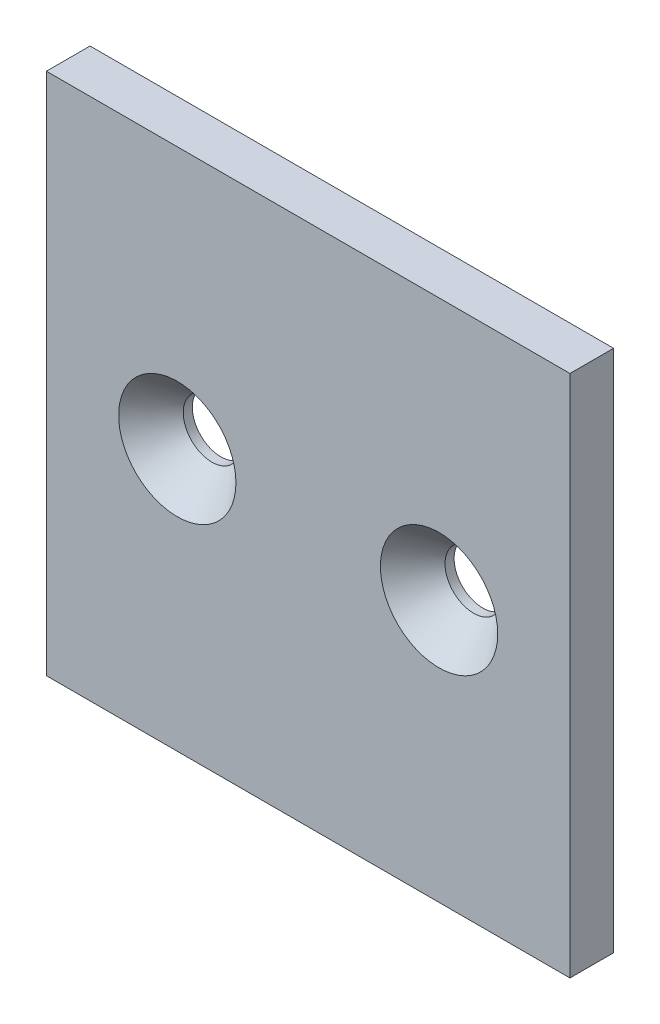
ISO-10303-21;
HEADER;
FILE_DESCRIPTION(('STEP AP214'),'2;1');
FILE_NAME('part.step','',(''),(''),'','','');
FILE_SCHEMA(('AUTOMOTIVE_DESIGN { 1 0 10303 214 1 1 1 1 }'));
ENDSEC;
DATA;
#1=APPLICATION_CONTEXT('core data for automotive mechanical design processes');
#2=APPLICATION_PROTOCOL_DEFINITION('international standard','automotive_design',2000,#1);
#3=PRODUCT_CONTEXT('',#1,'mechanical');
#4=PRODUCT('Part','Part','',(#3));
#5=PRODUCT_RELATED_PRODUCT_CATEGORY('part','',(#4));
#6=PRODUCT_DEFINITION_FORMATION('','',#4);
#7=PRODUCT_DEFINITION_CONTEXT('part definition',#1,'design');
#8=PRODUCT_DEFINITION('design','',#6,#7);
#9=PRODUCT_DEFINITION_SHAPE('','',#8);
#10=(LENGTH_UNIT() NAMED_UNIT(*) SI_UNIT(.MILLI.,.METRE.));
#11=(NAMED_UNIT(*) PLANE_ANGLE_UNIT() SI_UNIT($,.RADIAN.));
#12=(NAMED_UNIT(*) SI_UNIT($,.STERADIAN.) SOLID_ANGLE_UNIT());
#13=UNCERTAINTY_MEASURE_WITH_UNIT(LENGTH_MEASURE(1.E-05),#10,'distance_accuracy_value','');
#14=(GEOMETRIC_REPRESENTATION_CONTEXT(3) GLOBAL_UNCERTAINTY_ASSIGNED_CONTEXT((#13)) GLOBAL_UNIT_ASSIGNED_CONTEXT((#10,
#11,#12)) REPRESENTATION_CONTEXT('',''));
#15=CARTESIAN_POINT('',(0.,0.,0.));
#16=DIRECTION('',(0.,0.,1.));
#17=DIRECTION('',(1.,0.,0.));
#18=AXIS2_PLACEMENT_3D('',#15,#16,#17);
#19=CARTESIAN_POINT('',(0.,0.,3.175));
#20=DIRECTION('',(0.,0.,-1.));
#21=DIRECTION('',(-1.,0.,0.));
#22=AXIS2_PLACEMENT_3D('',#19,#20,#21);
#23=PLANE('',#22);
#24=CARTESIAN_POINT('',(19.05,38.1,3.175));
#25=DIRECTION('',(0.,0.,1.));
#26=DIRECTION('',(1.,0.,0.));
#27=AXIS2_PLACEMENT_3D('',#24,#25,#26);
#28=CIRCLE('',#27,8.53741686182538);
#29=CARTESIAN_POINT('',(27.5874168618254,38.1,3.175));
#30=VERTEX_POINT('',#29);
#31=EDGE_CURVE('E136',#30,#30,#28,.T.);
#32=ORIENTED_EDGE('',*,*,#31,.F.);
#33=EDGE_LOOP('',(#32));
#34=FACE_BOUND('',#33,.T.);
#35=DIRECTION('',(1.,0.,0.));
#36=VECTOR('',#35,1.);
#37=CARTESIAN_POINT('',(76.2,0.,3.175));
#38=LINE('',#37,#36);
#39=CARTESIAN_POINT('',(0.,0.,3.175));
#40=VERTEX_POINT('',#39);
#41=CARTESIAN_POINT('',(76.2,0.,3.175));
#42=VERTEX_POINT('',#41);
#43=EDGE_CURVE('E104',#40,#42,#38,.T.);
#44=ORIENTED_EDGE('',*,*,#43,.T.);
#45=DIRECTION('',(0.,1.,0.));
#46=VECTOR('',#45,1.);
#47=CARTESIAN_POINT('',(76.2,76.2,3.175));
#48=LINE('',#47,#46);
#49=CARTESIAN_POINT('',(76.2,76.2,3.175));
#50=VERTEX_POINT('',#49);
#51=EDGE_CURVE('E99',#42,#50,#48,.T.);
#52=ORIENTED_EDGE('',*,*,#51,.T.);
#53=DIRECTION('',(-1.,0.,0.));
#54=VECTOR('',#53,1.);
#55=CARTESIAN_POINT('',(76.2,76.2,3.175));
#56=LINE('',#55,#54);
#57=CARTESIAN_POINT('',(0.,76.2,3.175));
#58=VERTEX_POINT('',#57);
#59=EDGE_CURVE('E102',#50,#58,#56,.T.);
#60=ORIENTED_EDGE('',*,*,#59,.T.);
#61=DIRECTION('',(0.,-1.,0.));
#62=VECTOR('',#61,1.);
#63=CARTESIAN_POINT('',(0.,0.,3.175));
#64=LINE('',#63,#62);
#65=EDGE_CURVE('E69',#58,#40,#64,.T.);
#66=ORIENTED_EDGE('',*,*,#65,.T.);
#67=EDGE_LOOP('',(#44,#52,#60,#66));
#68=FACE_BOUND('',#67,.T.);
#69=CARTESIAN_POINT('',(57.15,38.1,3.175));
#70=DIRECTION('',(0.,0.,1.));
#71=DIRECTION('',(1.,0.,0.));
#72=AXIS2_PLACEMENT_3D('',#69,#70,#71);
#73=CIRCLE('',#72,8.53741686182538);
#74=CARTESIAN_POINT('',(65.6874168618254,38.1,3.175));
#75=VERTEX_POINT('',#74);
#76=EDGE_CURVE('E142',#75,#75,#73,.T.);
#77=ORIENTED_EDGE('',*,*,#76,.F.);
#78=EDGE_LOOP('',(#77));
#79=FACE_BOUND('',#78,.T.);
#80=ADVANCED_FACE('F52',(#34,#68,#79),#23,.F.);
#81=CARTESIAN_POINT('',(57.15,38.1,3.175));
#82=DIRECTION('',(0.,0.,-1.));
#83=DIRECTION('',(-1.,0.,0.));
#84=AXIS2_PLACEMENT_3D('',#81,#82,#83);
#85=CYLINDRICAL_SURFACE('',#84,4.1656);
#86=CARTESIAN_POINT('',(57.15,38.1,-3.175));
#87=DIRECTION('',(0.,0.,1.));
#88=DIRECTION('',(1.,0.,0.));
#89=AXIS2_PLACEMENT_3D('',#86,#87,#88);
#90=CIRCLE('',#89,4.1656);
#91=CARTESIAN_POINT('',(61.3156,38.1,-3.175));
#92=VERTEX_POINT('',#91);
#93=EDGE_CURVE('E133',#92,#92,#90,.T.);
#94=ORIENTED_EDGE('',*,*,#93,.F.);
#95=EDGE_LOOP('',(#94));
#96=FACE_BOUND('',#95,.T.);
#97=CARTESIAN_POINT('',(57.15,38.1,-1.8542));
#98=DIRECTION('',(0.,0.,1.));
#99=DIRECTION('',(1.,0.,0.));
#100=AXIS2_PLACEMENT_3D('',#97,#98,#99);
#101=CIRCLE('',#100,4.1656);
#102=CARTESIAN_POINT('',(61.3156,38.1,-1.8542));
#103=VERTEX_POINT('',#102);
#104=EDGE_CURVE('E145',#103,#103,#101,.T.);
#105=ORIENTED_EDGE('',*,*,#104,.T.);
#106=EDGE_LOOP('',(#105));
#107=FACE_BOUND('',#106,.T.);
#108=ADVANCED_FACE('F149',(#96,#107),#85,.F.);
#109=CARTESIAN_POINT('',(19.05,38.1,3.175));
#110=DIRECTION('',(0.,0.,-1.));
#111=DIRECTION('',(-1.,0.,0.));
#112=AXIS2_PLACEMENT_3D('',#109,#110,#111);
#113=CYLINDRICAL_SURFACE('',#112,4.1656);
#114=CARTESIAN_POINT('',(19.05,38.1,-3.175));
#115=DIRECTION('',(0.,0.,1.));
#116=DIRECTION('',(1.,0.,0.));
#117=AXIS2_PLACEMENT_3D('',#114,#115,#116);
#118=CIRCLE('',#117,4.1656);
#119=CARTESIAN_POINT('',(23.2156,38.1,-3.175));
#120=VERTEX_POINT('',#119);
#121=EDGE_CURVE('E119',#120,#120,#118,.T.);
#122=ORIENTED_EDGE('',*,*,#121,.F.);
#123=EDGE_LOOP('',(#122));
#124=FACE_BOUND('',#123,.T.);
#125=CARTESIAN_POINT('',(19.05,38.1,-1.8542));
#126=DIRECTION('',(0.,0.,1.));
#127=DIRECTION('',(1.,0.,0.));
#128=AXIS2_PLACEMENT_3D('',#125,#126,#127);
#129=CIRCLE('',#128,4.1656);
#130=CARTESIAN_POINT('',(23.2156,38.1,-1.8542));
#131=VERTEX_POINT('',#130);
#132=EDGE_CURVE('E139',#131,#131,#129,.T.);
#133=ORIENTED_EDGE('',*,*,#132,.T.);
#134=EDGE_LOOP('',(#133));
#135=FACE_BOUND('',#134,.T.);
#136=ADVANCED_FACE('F167',(#124,#135),#113,.F.);
#137=CARTESIAN_POINT('',(0.,0.,-3.175));
#138=DIRECTION('',(0.,0.,-1.));
#139=DIRECTION('',(-1.,0.,0.));
#140=AXIS2_PLACEMENT_3D('',#137,#138,#139);
#141=PLANE('',#140);
#142=ORIENTED_EDGE('',*,*,#121,.T.);
#143=EDGE_LOOP('',(#142));
#144=FACE_BOUND('',#143,.T.);
#145=DIRECTION('',(1.,0.,0.));
#146=VECTOR('',#145,1.);
#147=CARTESIAN_POINT('',(76.2,0.,-3.175));
#148=LINE('',#147,#146);
#149=CARTESIAN_POINT('',(0.,0.,-3.175));
#150=VERTEX_POINT('',#149);
#151=CARTESIAN_POINT('',(76.2,0.,-3.175));
#152=VERTEX_POINT('',#151);
#153=EDGE_CURVE('E116',#150,#152,#148,.T.);
#154=ORIENTED_EDGE('',*,*,#153,.F.);
#155=DIRECTION('',(0.,-1.,0.));
#156=VECTOR('',#155,1.);
#157=CARTESIAN_POINT('',(0.,0.,-3.175));
#158=LINE('',#157,#156);
#159=CARTESIAN_POINT('',(0.,76.2,-3.175));
#160=VERTEX_POINT('',#159);
#161=EDGE_CURVE('E92',#160,#150,#158,.T.);
#162=ORIENTED_EDGE('',*,*,#161,.F.);
#163=DIRECTION('',(-1.,0.,0.));
#164=VECTOR('',#163,1.);
#165=CARTESIAN_POINT('',(76.2,76.2,-3.175));
#166=LINE('',#165,#164);
#167=CARTESIAN_POINT('',(76.2,76.2,-3.175));
#168=VERTEX_POINT('',#167);
#169=EDGE_CURVE('E86',#168,#160,#166,.T.);
#170=ORIENTED_EDGE('',*,*,#169,.F.);
#171=DIRECTION('',(0.,1.,0.));
#172=VECTOR('',#171,1.);
#173=CARTESIAN_POINT('',(76.2,76.2,-3.175));
#174=LINE('',#173,#172);
#175=EDGE_CURVE('E108',#152,#168,#174,.T.);
#176=ORIENTED_EDGE('',*,*,#175,.F.);
#177=EDGE_LOOP('',(#154,#162,#170,#176));
#178=FACE_BOUND('',#177,.T.);
#179=ORIENTED_EDGE('',*,*,#93,.T.);
#180=EDGE_LOOP('',(#179));
#181=FACE_BOUND('',#180,.T.);
#182=ADVANCED_FACE('F127',(#144,#178,#181),#141,.T.);
#183=CARTESIAN_POINT('',(76.2,0.,3.175));
#184=DIRECTION('',(0.,1.,0.));
#185=DIRECTION('',(-1.,0.,0.));
#186=AXIS2_PLACEMENT_3D('',#183,#184,#185);
#187=PLANE('',#186);
#188=ORIENTED_EDGE('',*,*,#153,.T.);
#189=DIRECTION('',(0.,0.,-1.));
#190=VECTOR('',#189,1.);
#191=CARTESIAN_POINT('',(76.2,0.,3.175));
#192=LINE('',#191,#190);
#193=EDGE_CURVE('E12',#42,#152,#192,.T.);
#194=ORIENTED_EDGE('',*,*,#193,.F.);
#195=ORIENTED_EDGE('',*,*,#43,.F.);
#196=DIRECTION('',(0.,0.,-1.));
#197=VECTOR('',#196,1.);
#198=CARTESIAN_POINT('',(0.,0.,3.175));
#199=LINE('',#198,#197);
#200=EDGE_CURVE('E112',#40,#150,#199,.T.);
#201=ORIENTED_EDGE('',*,*,#200,.T.);
#202=EDGE_LOOP('',(#188,#194,#195,#201));
#203=FACE_BOUND('',#202,.T.);
#204=ADVANCED_FACE('F54',(#203),#187,.F.);
#205=CARTESIAN_POINT('',(76.2,76.2,3.175));
#206=DIRECTION('',(-1.,0.,0.));
#207=DIRECTION('',(0.,-1.,0.));
#208=AXIS2_PLACEMENT_3D('',#205,#206,#207);
#209=PLANE('',#208);
#210=ORIENTED_EDGE('',*,*,#175,.T.);
#211=DIRECTION('',(0.,0.,-1.));
#212=VECTOR('',#211,1.);
#213=CARTESIAN_POINT('',(76.2,76.2,3.175));
#214=LINE('',#213,#212);
#215=EDGE_CURVE('E61',#50,#168,#214,.T.);
#216=ORIENTED_EDGE('',*,*,#215,.F.);
#217=ORIENTED_EDGE('',*,*,#51,.F.);
#218=ORIENTED_EDGE('',*,*,#193,.T.);
#219=EDGE_LOOP('',(#210,#216,#217,#218));
#220=FACE_BOUND('',#219,.T.);
#221=ADVANCED_FACE('F107',(#220),#209,.F.);
#222=CARTESIAN_POINT('',(76.2,76.2,3.175));
#223=DIRECTION('',(0.,-1.,0.));
#224=DIRECTION('',(0.,0.,-1.));
#225=AXIS2_PLACEMENT_3D('',#222,#223,#224);
#226=PLANE('',#225);
#227=ORIENTED_EDGE('',*,*,#169,.T.);
#228=DIRECTION('',(0.,0.,-1.));
#229=VECTOR('',#228,1.);
#230=CARTESIAN_POINT('',(0.,76.2,3.175));
#231=LINE('',#230,#229);
#232=EDGE_CURVE('E109',#58,#160,#231,.T.);
#233=ORIENTED_EDGE('',*,*,#232,.F.);
#234=ORIENTED_EDGE('',*,*,#59,.F.);
#235=ORIENTED_EDGE('',*,*,#215,.T.);
#236=EDGE_LOOP('',(#227,#233,#234,#235));
#237=FACE_BOUND('',#236,.T.);
#238=ADVANCED_FACE('F110',(#237),#226,.F.);
#239=CARTESIAN_POINT('',(0.,0.,3.175));
#240=DIRECTION('',(1.,0.,0.));
#241=DIRECTION('',(0.,0.,-1.));
#242=AXIS2_PLACEMENT_3D('',#239,#240,#241);
#243=PLANE('',#242);
#244=ORIENTED_EDGE('',*,*,#161,.T.);
#245=ORIENTED_EDGE('',*,*,#200,.F.);
#246=ORIENTED_EDGE('',*,*,#65,.F.);
#247=ORIENTED_EDGE('',*,*,#232,.T.);
#248=EDGE_LOOP('',(#244,#245,#246,#247));
#249=FACE_BOUND('',#248,.T.);
#250=ADVANCED_FACE('F124',(#249),#243,.F.);
#251=CARTESIAN_POINT('',(19.05,38.1,-1.8542));
#252=DIRECTION('',(0.,0.,1.));
#253=DIRECTION('',(1.,0.,0.));
#254=AXIS2_PLACEMENT_3D('',#251,#252,#253);
#255=CONICAL_SURFACE('',#254,4.1656,0.715584993317677);
#256=ORIENTED_EDGE('',*,*,#31,.T.);
#257=EDGE_LOOP('',(#256));
#258=FACE_BOUND('',#257,.T.);
#259=ORIENTED_EDGE('',*,*,#132,.F.);
#260=EDGE_LOOP('',(#259));
#261=FACE_BOUND('',#260,.T.);
#262=ADVANCED_FACE('F153',(#258,#261),#255,.F.);
#263=CARTESIAN_POINT('',(57.15,38.1,-1.8542));
#264=DIRECTION('',(0.,0.,1.));
#265=DIRECTION('',(1.,0.,0.));
#266=AXIS2_PLACEMENT_3D('',#263,#264,#265);
#267=CONICAL_SURFACE('',#266,4.1656,0.715584993317677);
#268=ORIENTED_EDGE('',*,*,#76,.T.);
#269=EDGE_LOOP('',(#268));
#270=FACE_BOUND('',#269,.T.);
#271=ORIENTED_EDGE('',*,*,#104,.F.);
#272=EDGE_LOOP('',(#271));
#273=FACE_BOUND('',#272,.T.);
#274=ADVANCED_FACE('F151',(#270,#273),#267,.F.);
#275=CLOSED_SHELL('',(#80,#108,#136,#182,#204,#221,#238,#250,#262,#274));
#276=MANIFOLD_SOLID_BREP('B2',#275);
#277=ADVANCED_BREP_SHAPE_REPRESENTATION('',(#18,#276),#14);
#278=SHAPE_DEFINITION_REPRESENTATION(#9,#277);
ENDSEC;
END-ISO-10303-21;
